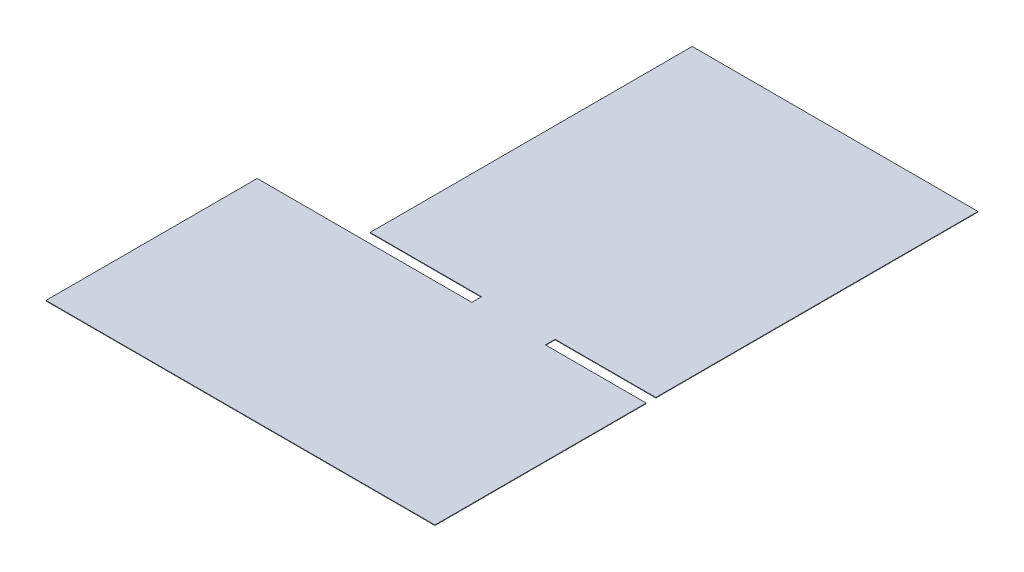
ISO-10303-21;
HEADER;
FILE_DESCRIPTION(('STEP AP214'),'2;1');
FILE_NAME('part.step','',(''),(''),'','','');
FILE_SCHEMA(('AUTOMOTIVE_DESIGN { 1 0 10303 214 1 1 1 1 }'));
ENDSEC;
DATA;
#1=APPLICATION_CONTEXT('core data for automotive mechanical design processes');
#2=APPLICATION_PROTOCOL_DEFINITION('international standard','automotive_design',2000,#1);
#3=PRODUCT_CONTEXT('',#1,'mechanical');
#4=PRODUCT('Part','Part','',(#3));
#5=PRODUCT_RELATED_PRODUCT_CATEGORY('part','',(#4));
#6=PRODUCT_DEFINITION_FORMATION('','',#4);
#7=PRODUCT_DEFINITION_CONTEXT('part definition',#1,'design');
#8=PRODUCT_DEFINITION('design','',#6,#7);
#9=PRODUCT_DEFINITION_SHAPE('','',#8);
#10=(LENGTH_UNIT() NAMED_UNIT(*) SI_UNIT(.MILLI.,.METRE.));
#11=(NAMED_UNIT(*) PLANE_ANGLE_UNIT() SI_UNIT($,.RADIAN.));
#12=(NAMED_UNIT(*) SI_UNIT($,.STERADIAN.) SOLID_ANGLE_UNIT());
#13=UNCERTAINTY_MEASURE_WITH_UNIT(LENGTH_MEASURE(1.E-05),#10,'distance_accuracy_value','');
#14=(GEOMETRIC_REPRESENTATION_CONTEXT(3) GLOBAL_UNCERTAINTY_ASSIGNED_CONTEXT((#13)) GLOBAL_UNIT_ASSIGNED_CONTEXT((#10,
#11,#12)) REPRESENTATION_CONTEXT('',''));
#15=CARTESIAN_POINT('',(0.,0.,0.));
#16=DIRECTION('',(0.,0.,1.));
#17=DIRECTION('',(1.,0.,0.));
#18=AXIS2_PLACEMENT_3D('',#15,#16,#17);
#19=CARTESIAN_POINT('',(8030.,10.,-4560.));
#20=DIRECTION('',(0.,0.,-1.));
#21=DIRECTION('',(-1.,0.,0.));
#22=AXIS2_PLACEMENT_3D('',#19,#20,#21);
#23=PLANE('',#22);
#24=DIRECTION('',(1.,0.,0.));
#25=VECTOR('',#24,1.);
#26=CARTESIAN_POINT('',(8030.,0.,-4560.));
#27=LINE('',#26,#25);
#28=CARTESIAN_POINT('',(5950.,0.,-4560.));
#29=VERTEX_POINT('',#28);
#30=CARTESIAN_POINT('',(8030.,0.,-4560.));
#31=VERTEX_POINT('',#30);
#32=EDGE_CURVE('E163',#29,#31,#27,.T.);
#33=ORIENTED_EDGE('',*,*,#32,.T.);
#34=DIRECTION('',(0.,-1.,0.));
#35=VECTOR('',#34,1.);
#36=CARTESIAN_POINT('',(8030.,10.,-4560.));
#37=LINE('',#36,#35);
#38=CARTESIAN_POINT('',(8030.,10.,-4560.));
#39=VERTEX_POINT('',#38);
#40=EDGE_CURVE('E11',#39,#31,#37,.T.);
#41=ORIENTED_EDGE('',*,*,#40,.F.);
#42=DIRECTION('',(1.,0.,0.));
#43=VECTOR('',#42,1.);
#44=CARTESIAN_POINT('',(8030.,10.,-4560.));
#45=LINE('',#44,#43);
#46=CARTESIAN_POINT('',(5950.,10.,-4560.));
#47=VERTEX_POINT('',#46);
#48=EDGE_CURVE('E185',#47,#39,#45,.T.);
#49=ORIENTED_EDGE('',*,*,#48,.F.);
#50=DIRECTION('',(0.,-1.,0.));
#51=VECTOR('',#50,1.);
#52=CARTESIAN_POINT('',(5950.,10.,-4560.));
#53=LINE('',#52,#51);
#54=EDGE_CURVE('E159',#47,#29,#53,.T.);
#55=ORIENTED_EDGE('',*,*,#54,.T.);
#56=EDGE_LOOP('',(#33,#41,#49,#55));
#57=FACE_BOUND('',#56,.T.);
#58=ADVANCED_FACE('F43',(#57),#23,.F.);
#59=CARTESIAN_POINT('',(8030.,10.,-11210.));
#60=DIRECTION('',(-1.,0.,0.));
#61=DIRECTION('',(0.,0.,1.));
#62=AXIS2_PLACEMENT_3D('',#59,#60,#61);
#63=PLANE('',#62);
#64=DIRECTION('',(0.,0.,-1.));
#65=VECTOR('',#64,1.);
#66=CARTESIAN_POINT('',(8030.,0.,-11210.));
#67=LINE('',#66,#65);
#68=CARTESIAN_POINT('',(8030.,0.,-11210.));
#69=VERTEX_POINT('',#68);
#70=EDGE_CURVE('E166',#31,#69,#67,.T.);
#71=ORIENTED_EDGE('',*,*,#70,.T.);
#72=DIRECTION('',(0.,-1.,0.));
#73=VECTOR('',#72,1.);
#74=CARTESIAN_POINT('',(8030.,10.,-11210.));
#75=LINE('',#74,#73);
#76=CARTESIAN_POINT('',(8030.,10.,-11210.));
#77=VERTEX_POINT('',#76);
#78=EDGE_CURVE('E51',#77,#69,#75,.T.);
#79=ORIENTED_EDGE('',*,*,#78,.F.);
#80=DIRECTION('',(0.,0.,-1.));
#81=VECTOR('',#80,1.);
#82=CARTESIAN_POINT('',(8030.,10.,-11210.));
#83=LINE('',#82,#81);
#84=EDGE_CURVE('E114',#39,#77,#83,.T.);
#85=ORIENTED_EDGE('',*,*,#84,.F.);
#86=ORIENTED_EDGE('',*,*,#40,.T.);
#87=EDGE_LOOP('',(#71,#79,#85,#86));
#88=FACE_BOUND('',#87,.T.);
#89=ADVANCED_FACE('F263',(#88),#63,.F.);
#90=CARTESIAN_POINT('',(2130.,10.,-11210.));
#91=DIRECTION('',(0.,0.,1.));
#92=DIRECTION('',(1.,0.,0.));
#93=AXIS2_PLACEMENT_3D('',#90,#91,#92);
#94=PLANE('',#93);
#95=DIRECTION('',(-1.,0.,0.));
#96=VECTOR('',#95,1.);
#97=CARTESIAN_POINT('',(2130.,0.,-11210.));
#98=LINE('',#97,#96);
#99=CARTESIAN_POINT('',(2130.,0.,-11210.));
#100=VERTEX_POINT('',#99);
#101=EDGE_CURVE('E168',#69,#100,#98,.T.);
#102=ORIENTED_EDGE('',*,*,#101,.T.);
#103=DIRECTION('',(0.,-1.,0.));
#104=VECTOR('',#103,1.);
#105=CARTESIAN_POINT('',(2130.,10.,-11210.));
#106=LINE('',#105,#104);
#107=CARTESIAN_POINT('',(2130.,10.,-11210.));
#108=VERTEX_POINT('',#107);
#109=EDGE_CURVE('E204',#108,#100,#106,.T.);
#110=ORIENTED_EDGE('',*,*,#109,.F.);
#111=DIRECTION('',(-1.,0.,0.));
#112=VECTOR('',#111,1.);
#113=CARTESIAN_POINT('',(2130.,10.,-11210.));
#114=LINE('',#113,#112);
#115=EDGE_CURVE('E212',#77,#108,#114,.T.);
#116=ORIENTED_EDGE('',*,*,#115,.F.);
#117=ORIENTED_EDGE('',*,*,#78,.T.);
#118=EDGE_LOOP('',(#102,#110,#116,#117));
#119=FACE_BOUND('',#118,.T.);
#120=ADVANCED_FACE('F210',(#119),#94,.F.);
#121=CARTESIAN_POINT('',(2130.,10.,-4560.));
#122=DIRECTION('',(1.,0.,0.));
#123=DIRECTION('',(0.,0.,-1.));
#124=AXIS2_PLACEMENT_3D('',#121,#122,#123);
#125=PLANE('',#124);
#126=DIRECTION('',(0.,0.,1.));
#127=VECTOR('',#126,1.);
#128=CARTESIAN_POINT('',(2130.,0.,-4560.));
#129=LINE('',#128,#127);
#130=CARTESIAN_POINT('',(2130.,0.,-4560.));
#131=VERTEX_POINT('',#130);
#132=EDGE_CURVE('E170',#100,#131,#129,.T.);
#133=ORIENTED_EDGE('',*,*,#132,.T.);
#134=DIRECTION('',(0.,-1.,0.));
#135=VECTOR('',#134,1.);
#136=CARTESIAN_POINT('',(2130.,10.,-4560.));
#137=LINE('',#136,#135);
#138=CARTESIAN_POINT('',(2130.,10.,-4560.));
#139=VERTEX_POINT('',#138);
#140=EDGE_CURVE('E201',#139,#131,#137,.T.);
#141=ORIENTED_EDGE('',*,*,#140,.F.);
#142=DIRECTION('',(0.,0.,1.));
#143=VECTOR('',#142,1.);
#144=CARTESIAN_POINT('',(2130.,10.,-4560.));
#145=LINE('',#144,#143);
#146=EDGE_CURVE('E230',#108,#139,#145,.T.);
#147=ORIENTED_EDGE('',*,*,#146,.F.);
#148=ORIENTED_EDGE('',*,*,#109,.T.);
#149=EDGE_LOOP('',(#133,#141,#147,#148));
#150=FACE_BOUND('',#149,.T.);
#151=ADVANCED_FACE('F221',(#150),#125,.F.);
#152=CARTESIAN_POINT('',(4430.,10.,-4560.));
#153=DIRECTION('',(0.,0.,-1.));
#154=DIRECTION('',(-1.,0.,0.));
#155=AXIS2_PLACEMENT_3D('',#152,#153,#154);
#156=PLANE('',#155);
#157=DIRECTION('',(1.,0.,0.));
#158=VECTOR('',#157,1.);
#159=CARTESIAN_POINT('',(4430.,0.,-4560.));
#160=LINE('',#159,#158);
#161=CARTESIAN_POINT('',(4430.,0.,-4560.));
#162=VERTEX_POINT('',#161);
#163=EDGE_CURVE('E172',#131,#162,#160,.T.);
#164=ORIENTED_EDGE('',*,*,#163,.T.);
#165=DIRECTION('',(0.,-1.,0.));
#166=VECTOR('',#165,1.);
#167=CARTESIAN_POINT('',(4430.,10.,-4560.));
#168=LINE('',#167,#166);
#169=CARTESIAN_POINT('',(4430.,10.,-4560.));
#170=VERTEX_POINT('',#169);
#171=EDGE_CURVE('E198',#170,#162,#168,.T.);
#172=ORIENTED_EDGE('',*,*,#171,.F.);
#173=DIRECTION('',(1.,0.,0.));
#174=VECTOR('',#173,1.);
#175=CARTESIAN_POINT('',(4430.,10.,-4560.));
#176=LINE('',#175,#174);
#177=EDGE_CURVE('E227',#139,#170,#176,.T.);
#178=ORIENTED_EDGE('',*,*,#177,.F.);
#179=ORIENTED_EDGE('',*,*,#140,.T.);
#180=EDGE_LOOP('',(#164,#172,#178,#179));
#181=FACE_BOUND('',#180,.T.);
#182=ADVANCED_FACE('F225',(#181),#156,.F.);
#183=CARTESIAN_POINT('',(4430.,10.,-4360.));
#184=DIRECTION('',(1.,0.,0.));
#185=DIRECTION('',(0.,0.,-1.));
#186=AXIS2_PLACEMENT_3D('',#183,#184,#185);
#187=PLANE('',#186);
#188=DIRECTION('',(0.,0.,1.));
#189=VECTOR('',#188,1.);
#190=CARTESIAN_POINT('',(4430.,0.,-4360.));
#191=LINE('',#190,#189);
#192=CARTESIAN_POINT('',(4430.,0.,-4360.));
#193=VERTEX_POINT('',#192);
#194=EDGE_CURVE('E174',#162,#193,#191,.T.);
#195=ORIENTED_EDGE('',*,*,#194,.T.);
#196=DIRECTION('',(0.,-1.,0.));
#197=VECTOR('',#196,1.);
#198=CARTESIAN_POINT('',(4430.,10.,-4360.));
#199=LINE('',#198,#197);
#200=CARTESIAN_POINT('',(4430.,10.,-4360.));
#201=VERTEX_POINT('',#200);
#202=EDGE_CURVE('E195',#201,#193,#199,.T.);
#203=ORIENTED_EDGE('',*,*,#202,.F.);
#204=DIRECTION('',(0.,0.,1.));
#205=VECTOR('',#204,1.);
#206=CARTESIAN_POINT('',(4430.,10.,-4360.));
#207=LINE('',#206,#205);
#208=EDGE_CURVE('E229',#170,#201,#207,.T.);
#209=ORIENTED_EDGE('',*,*,#208,.F.);
#210=ORIENTED_EDGE('',*,*,#171,.T.);
#211=EDGE_LOOP('',(#195,#203,#209,#210));
#212=FACE_BOUND('',#211,.T.);
#213=ADVANCED_FACE('F276',(#212),#187,.F.);
#214=CARTESIAN_POINT('',(4430.,10.,-4360.));
#215=DIRECTION('',(0.,0.,1.));
#216=DIRECTION('',(1.,0.,0.));
#217=AXIS2_PLACEMENT_3D('',#214,#215,#216);
#218=PLANE('',#217);
#219=DIRECTION('',(-1.,0.,0.));
#220=VECTOR('',#219,1.);
#221=CARTESIAN_POINT('',(4430.,0.,-4360.));
#222=LINE('',#221,#220);
#223=CARTESIAN_POINT('',(-5.26598123633362E-13,0.,-4360.));
#224=VERTEX_POINT('',#223);
#225=EDGE_CURVE('E176',#193,#224,#222,.T.);
#226=ORIENTED_EDGE('',*,*,#225,.T.);
#227=DIRECTION('',(0.,-1.,0.));
#228=VECTOR('',#227,1.);
#229=CARTESIAN_POINT('',(-5.26598123633362E-13,10.,-4360.));
#230=LINE('',#229,#228);
#231=CARTESIAN_POINT('',(-5.26598123633362E-13,10.,-4360.));
#232=VERTEX_POINT('',#231);
#233=EDGE_CURVE('E192',#232,#224,#230,.T.);
#234=ORIENTED_EDGE('',*,*,#233,.F.);
#235=DIRECTION('',(-1.,0.,0.));
#236=VECTOR('',#235,1.);
#237=CARTESIAN_POINT('',(4430.,10.,-4360.));
#238=LINE('',#237,#236);
#239=EDGE_CURVE('E232',#201,#232,#238,.T.);
#240=ORIENTED_EDGE('',*,*,#239,.F.);
#241=ORIENTED_EDGE('',*,*,#202,.T.);
#242=EDGE_LOOP('',(#226,#234,#240,#241));
#243=FACE_BOUND('',#242,.T.);
#244=ADVANCED_FACE('F279',(#243),#218,.F.);
#245=CARTESIAN_POINT('',(-5.26598123633362E-13,10.,-4360.));
#246=DIRECTION('',(1.,0.,0.));
#247=DIRECTION('',(0.,0.,-1.));
#248=AXIS2_PLACEMENT_3D('',#245,#246,#247);
#249=PLANE('',#248);
#250=DIRECTION('',(0.,0.,1.));
#251=VECTOR('',#250,1.);
#252=CARTESIAN_POINT('',(-5.26598123633362E-13,0.,-4360.));
#253=LINE('',#252,#251);
#254=CARTESIAN_POINT('',(0.,0.,0.));
#255=VERTEX_POINT('',#254);
#256=EDGE_CURVE('E178',#224,#255,#253,.T.);
#257=ORIENTED_EDGE('',*,*,#256,.T.);
#258=DIRECTION('',(0.,-1.,0.));
#259=VECTOR('',#258,1.);
#260=CARTESIAN_POINT('',(0.,10.,0.));
#261=LINE('',#260,#259);
#262=CARTESIAN_POINT('',(0.,10.,0.));
#263=VERTEX_POINT('',#262);
#264=EDGE_CURVE('E189',#263,#255,#261,.T.);
#265=ORIENTED_EDGE('',*,*,#264,.F.);
#266=DIRECTION('',(0.,0.,1.));
#267=VECTOR('',#266,1.);
#268=CARTESIAN_POINT('',(-5.26598123633362E-13,10.,-4360.));
#269=LINE('',#268,#267);
#270=EDGE_CURVE('E238',#232,#263,#269,.T.);
#271=ORIENTED_EDGE('',*,*,#270,.F.);
#272=ORIENTED_EDGE('',*,*,#233,.T.);
#273=EDGE_LOOP('',(#257,#265,#271,#272));
#274=FACE_BOUND('',#273,.T.);
#275=ADVANCED_FACE('F244',(#274),#249,.F.);
#276=CARTESIAN_POINT('',(0.,10.,0.));
#277=DIRECTION('',(0.,0.,-1.));
#278=DIRECTION('',(-1.,0.,0.));
#279=AXIS2_PLACEMENT_3D('',#276,#277,#278);
#280=PLANE('',#279);
#281=DIRECTION('',(1.,0.,0.));
#282=VECTOR('',#281,1.);
#283=CARTESIAN_POINT('',(0.,0.,0.));
#284=LINE('',#283,#282);
#285=CARTESIAN_POINT('',(8030.,0.,-1.77635683940025E-12));
#286=VERTEX_POINT('',#285);
#287=EDGE_CURVE('E180',#255,#286,#284,.T.);
#288=ORIENTED_EDGE('',*,*,#287,.T.);
#289=DIRECTION('',(0.,-1.,0.));
#290=VECTOR('',#289,1.);
#291=CARTESIAN_POINT('',(8030.,10.,-1.77635683940025E-12));
#292=LINE('',#291,#290);
#293=CARTESIAN_POINT('',(8030.,10.,-1.77635683940025E-12));
#294=VERTEX_POINT('',#293);
#295=EDGE_CURVE('E154',#294,#286,#292,.T.);
#296=ORIENTED_EDGE('',*,*,#295,.F.);
#297=DIRECTION('',(1.,0.,0.));
#298=VECTOR('',#297,1.);
#299=CARTESIAN_POINT('',(0.,10.,0.));
#300=LINE('',#299,#298);
#301=EDGE_CURVE('E145',#263,#294,#300,.T.);
#302=ORIENTED_EDGE('',*,*,#301,.F.);
#303=ORIENTED_EDGE('',*,*,#264,.T.);
#304=EDGE_LOOP('',(#288,#296,#302,#303));
#305=FACE_BOUND('',#304,.T.);
#306=ADVANCED_FACE('F248',(#305),#280,.F.);
#307=CARTESIAN_POINT('',(8030.,10.,-1.77635683940025E-12));
#308=DIRECTION('',(-1.,0.,0.));
#309=DIRECTION('',(0.,0.,1.));
#310=AXIS2_PLACEMENT_3D('',#307,#308,#309);
#311=PLANE('',#310);
#312=DIRECTION('',(0.,0.,-1.));
#313=VECTOR('',#312,1.);
#314=CARTESIAN_POINT('',(8030.,0.,-1.77635683940025E-12));
#315=LINE('',#314,#313);
#316=CARTESIAN_POINT('',(8030.,0.,-4360.));
#317=VERTEX_POINT('',#316);
#318=EDGE_CURVE('E153',#286,#317,#315,.T.);
#319=ORIENTED_EDGE('',*,*,#318,.T.);
#320=DIRECTION('',(0.,-1.,0.));
#321=VECTOR('',#320,1.);
#322=CARTESIAN_POINT('',(8030.,10.,-4360.));
#323=LINE('',#322,#321);
#324=CARTESIAN_POINT('',(8030.,10.,-4360.));
#325=VERTEX_POINT('',#324);
#326=EDGE_CURVE('E150',#325,#317,#323,.T.);
#327=ORIENTED_EDGE('',*,*,#326,.F.);
#328=DIRECTION('',(0.,0.,-1.));
#329=VECTOR('',#328,1.);
#330=CARTESIAN_POINT('',(8030.,10.,-1.77635683940025E-12));
#331=LINE('',#330,#329);
#332=EDGE_CURVE('E139',#294,#325,#331,.T.);
#333=ORIENTED_EDGE('',*,*,#332,.F.);
#334=ORIENTED_EDGE('',*,*,#295,.T.);
#335=EDGE_LOOP('',(#319,#327,#333,#334));
#336=FACE_BOUND('',#335,.T.);
#337=ADVANCED_FACE('F151',(#336),#311,.F.);
#338=CARTESIAN_POINT('',(5950.,10.,-4360.));
#339=DIRECTION('',(0.,0.,1.));
#340=DIRECTION('',(1.,0.,0.));
#341=AXIS2_PLACEMENT_3D('',#338,#339,#340);
#342=PLANE('',#341);
#343=DIRECTION('',(-1.,0.,0.));
#344=VECTOR('',#343,1.);
#345=CARTESIAN_POINT('',(5950.,0.,-4360.));
#346=LINE('',#345,#344);
#347=CARTESIAN_POINT('',(5950.,0.,-4360.));
#348=VERTEX_POINT('',#347);
#349=EDGE_CURVE('E100',#317,#348,#346,.T.);
#350=ORIENTED_EDGE('',*,*,#349,.T.);
#351=DIRECTION('',(0.,-1.,0.));
#352=VECTOR('',#351,1.);
#353=CARTESIAN_POINT('',(5950.,10.,-4360.));
#354=LINE('',#353,#352);
#355=CARTESIAN_POINT('',(5950.,10.,-4360.));
#356=VERTEX_POINT('',#355);
#357=EDGE_CURVE('E155',#356,#348,#354,.T.);
#358=ORIENTED_EDGE('',*,*,#357,.F.);
#359=DIRECTION('',(-1.,0.,0.));
#360=VECTOR('',#359,1.);
#361=CARTESIAN_POINT('',(5950.,10.,-4360.));
#362=LINE('',#361,#360);
#363=EDGE_CURVE('E143',#325,#356,#362,.T.);
#364=ORIENTED_EDGE('',*,*,#363,.F.);
#365=ORIENTED_EDGE('',*,*,#326,.T.);
#366=EDGE_LOOP('',(#350,#358,#364,#365));
#367=FACE_BOUND('',#366,.T.);
#368=ADVANCED_FACE('F157',(#367),#342,.F.);
#369=CARTESIAN_POINT('',(5950.,10.,-4560.));
#370=DIRECTION('',(-1.,0.,0.));
#371=DIRECTION('',(0.,0.,1.));
#372=AXIS2_PLACEMENT_3D('',#369,#370,#371);
#373=PLANE('',#372);
#374=DIRECTION('',(0.,0.,-1.));
#375=VECTOR('',#374,1.);
#376=CARTESIAN_POINT('',(5950.,0.,-4560.));
#377=LINE('',#376,#375);
#378=EDGE_CURVE('E106',#348,#29,#377,.T.);
#379=ORIENTED_EDGE('',*,*,#378,.T.);
#380=ORIENTED_EDGE('',*,*,#54,.F.);
#381=DIRECTION('',(0.,0.,-1.));
#382=VECTOR('',#381,1.);
#383=CARTESIAN_POINT('',(5950.,10.,-4560.));
#384=LINE('',#383,#382);
#385=EDGE_CURVE('E59',#356,#47,#384,.T.);
#386=ORIENTED_EDGE('',*,*,#385,.F.);
#387=ORIENTED_EDGE('',*,*,#357,.T.);
#388=EDGE_LOOP('',(#379,#380,#386,#387));
#389=FACE_BOUND('',#388,.T.);
#390=ADVANCED_FACE('F252',(#389),#373,.F.);
#391=CARTESIAN_POINT('',(0.,10.,0.));
#392=DIRECTION('',(0.,1.,0.));
#393=DIRECTION('',(0.,0.,1.));
#394=AXIS2_PLACEMENT_3D('',#391,#392,#393);
#395=PLANE('',#394);
#396=ORIENTED_EDGE('',*,*,#48,.T.);
#397=ORIENTED_EDGE('',*,*,#84,.T.);
#398=ORIENTED_EDGE('',*,*,#115,.T.);
#399=ORIENTED_EDGE('',*,*,#146,.T.);
#400=ORIENTED_EDGE('',*,*,#177,.T.);
#401=ORIENTED_EDGE('',*,*,#208,.T.);
#402=ORIENTED_EDGE('',*,*,#239,.T.);
#403=ORIENTED_EDGE('',*,*,#270,.T.);
#404=ORIENTED_EDGE('',*,*,#301,.T.);
#405=ORIENTED_EDGE('',*,*,#332,.T.);
#406=ORIENTED_EDGE('',*,*,#363,.T.);
#407=ORIENTED_EDGE('',*,*,#385,.T.);
#408=EDGE_LOOP('',(#396,#397,#398,#399,#400,#401,#402,#403,#404,#405,#406,#407));
#409=FACE_BOUND('',#408,.T.);
#410=ADVANCED_FACE('F141',(#409),#395,.T.);
#411=CARTESIAN_POINT('',(0.,0.,0.));
#412=DIRECTION('',(0.,1.,0.));
#413=DIRECTION('',(0.,0.,1.));
#414=AXIS2_PLACEMENT_3D('',#411,#412,#413);
#415=PLANE('',#414);
#416=ORIENTED_EDGE('',*,*,#32,.F.);
#417=ORIENTED_EDGE('',*,*,#378,.F.);
#418=ORIENTED_EDGE('',*,*,#349,.F.);
#419=ORIENTED_EDGE('',*,*,#318,.F.);
#420=ORIENTED_EDGE('',*,*,#287,.F.);
#421=ORIENTED_EDGE('',*,*,#256,.F.);
#422=ORIENTED_EDGE('',*,*,#225,.F.);
#423=ORIENTED_EDGE('',*,*,#194,.F.);
#424=ORIENTED_EDGE('',*,*,#163,.F.);
#425=ORIENTED_EDGE('',*,*,#132,.F.);
#426=ORIENTED_EDGE('',*,*,#101,.F.);
#427=ORIENTED_EDGE('',*,*,#70,.F.);
#428=EDGE_LOOP('',(#416,#417,#418,#419,#420,#421,#422,#423,#424,#425,#426,#427));
#429=FACE_BOUND('',#428,.T.);
#430=ADVANCED_FACE('F216',(#429),#415,.F.);
#431=CLOSED_SHELL('',(#58,#89,#120,#151,#182,#213,#244,#275,#306,#337,#368,#390,#410,#430));
#432=MANIFOLD_SOLID_BREP('B2',#431);
#433=ADVANCED_BREP_SHAPE_REPRESENTATION('',(#18,#432),#14);
#434=SHAPE_DEFINITION_REPRESENTATION(#9,#433);
ENDSEC;
END-ISO-10303-21;
